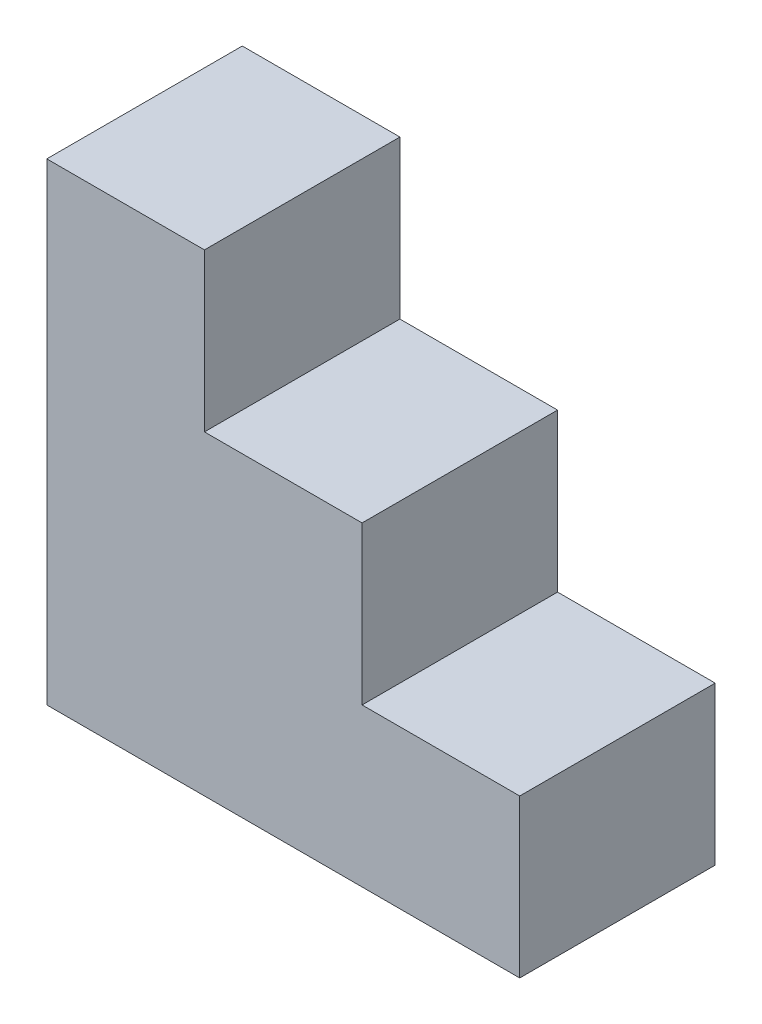
ISO-10303-21;
HEADER;
FILE_DESCRIPTION(('STEP AP214'),'2;1');
FILE_NAME('part.step','',(''),(''),'','','');
FILE_SCHEMA(('AUTOMOTIVE_DESIGN { 1 0 10303 214 1 1 1 1 }'));
ENDSEC;
DATA;
#1=APPLICATION_CONTEXT('core data for automotive mechanical design processes');
#2=APPLICATION_PROTOCOL_DEFINITION('international standard','automotive_design',2000,#1);
#3=PRODUCT_CONTEXT('',#1,'mechanical');
#4=PRODUCT('Part','Part','',(#3));
#5=PRODUCT_RELATED_PRODUCT_CATEGORY('part','',(#4));
#6=PRODUCT_DEFINITION_FORMATION('','',#4);
#7=PRODUCT_DEFINITION_CONTEXT('part definition',#1,'design');
#8=PRODUCT_DEFINITION('design','',#6,#7);
#9=PRODUCT_DEFINITION_SHAPE('','',#8);
#10=(LENGTH_UNIT() NAMED_UNIT(*) SI_UNIT(.MILLI.,.METRE.));
#11=(NAMED_UNIT(*) PLANE_ANGLE_UNIT() SI_UNIT($,.RADIAN.));
#12=(NAMED_UNIT(*) SI_UNIT($,.STERADIAN.) SOLID_ANGLE_UNIT());
#13=UNCERTAINTY_MEASURE_WITH_UNIT(LENGTH_MEASURE(1.E-05),#10,'distance_accuracy_value','');
#14=(GEOMETRIC_REPRESENTATION_CONTEXT(3) GLOBAL_UNCERTAINTY_ASSIGNED_CONTEXT((#13)) GLOBAL_UNIT_ASSIGNED_CONTEXT((#10,
#11,#12)) REPRESENTATION_CONTEXT('',''));
#15=CARTESIAN_POINT('',(0.,0.,0.));
#16=DIRECTION('',(0.,0.,1.));
#17=DIRECTION('',(1.,0.,0.));
#18=AXIS2_PLACEMENT_3D('',#15,#16,#17);
#19=CARTESIAN_POINT('',(0.,0.,12.4));
#20=DIRECTION('',(1.,0.,0.));
#21=DIRECTION('',(0.,0.,-1.));
#22=AXIS2_PLACEMENT_3D('',#19,#20,#21);
#23=PLANE('',#22);
#24=DIRECTION('',(0.,-1.,0.));
#25=VECTOR('',#24,1.);
#26=CARTESIAN_POINT('',(0.,0.,0.));
#27=LINE('',#26,#25);
#28=CARTESIAN_POINT('',(0.,30.,0.));
#29=VERTEX_POINT('',#28);
#30=CARTESIAN_POINT('',(0.,0.,0.));
#31=VERTEX_POINT('',#30);
#32=EDGE_CURVE('E129',#29,#31,#27,.T.);
#33=ORIENTED_EDGE('',*,*,#32,.T.);
#34=DIRECTION('',(0.,0.,-1.));
#35=VECTOR('',#34,1.);
#36=CARTESIAN_POINT('',(0.,0.,12.4));
#37=LINE('',#36,#35);
#38=CARTESIAN_POINT('',(0.,0.,12.4));
#39=VERTEX_POINT('',#38);
#40=EDGE_CURVE('E11',#39,#31,#37,.T.);
#41=ORIENTED_EDGE('',*,*,#40,.F.);
#42=DIRECTION('',(0.,-1.,0.));
#43=VECTOR('',#42,1.);
#44=CARTESIAN_POINT('',(0.,0.,12.4));
#45=LINE('',#44,#43);
#46=CARTESIAN_POINT('',(0.,30.,12.4));
#47=VERTEX_POINT('',#46);
#48=EDGE_CURVE('E143',#47,#39,#45,.T.);
#49=ORIENTED_EDGE('',*,*,#48,.F.);
#50=DIRECTION('',(0.,0.,-1.));
#51=VECTOR('',#50,1.);
#52=CARTESIAN_POINT('',(0.,30.,12.4));
#53=LINE('',#52,#51);
#54=EDGE_CURVE('E125',#47,#29,#53,.T.);
#55=ORIENTED_EDGE('',*,*,#54,.T.);
#56=EDGE_LOOP('',(#33,#41,#49,#55));
#57=FACE_BOUND('',#56,.T.);
#58=ADVANCED_FACE('F33',(#57),#23,.F.);
#59=CARTESIAN_POINT('',(0.,0.,12.4));
#60=DIRECTION('',(0.,1.,0.));
#61=DIRECTION('',(0.,0.,1.));
#62=AXIS2_PLACEMENT_3D('',#59,#60,#61);
#63=PLANE('',#62);
#64=DIRECTION('',(1.,0.,0.));
#65=VECTOR('',#64,1.);
#66=CARTESIAN_POINT('',(0.,0.,0.));
#67=LINE('',#66,#65);
#68=CARTESIAN_POINT('',(30.,0.,0.));
#69=VERTEX_POINT('',#68);
#70=EDGE_CURVE('E132',#31,#69,#67,.T.);
#71=ORIENTED_EDGE('',*,*,#70,.T.);
#72=DIRECTION('',(0.,0.,-1.));
#73=VECTOR('',#72,1.);
#74=CARTESIAN_POINT('',(30.,0.,12.4));
#75=LINE('',#74,#73);
#76=CARTESIAN_POINT('',(30.,0.,12.4));
#77=VERTEX_POINT('',#76);
#78=EDGE_CURVE('E41',#77,#69,#75,.T.);
#79=ORIENTED_EDGE('',*,*,#78,.F.);
#80=DIRECTION('',(1.,0.,0.));
#81=VECTOR('',#80,1.);
#82=CARTESIAN_POINT('',(0.,0.,12.4));
#83=LINE('',#82,#81);
#84=EDGE_CURVE('E92',#39,#77,#83,.T.);
#85=ORIENTED_EDGE('',*,*,#84,.F.);
#86=ORIENTED_EDGE('',*,*,#40,.T.);
#87=EDGE_LOOP('',(#71,#79,#85,#86));
#88=FACE_BOUND('',#87,.T.);
#89=ADVANCED_FACE('F178',(#88),#63,.F.);
#90=CARTESIAN_POINT('',(30.,0.,12.4));
#91=DIRECTION('',(-1.,0.,0.));
#92=DIRECTION('',(0.,0.,1.));
#93=AXIS2_PLACEMENT_3D('',#90,#91,#92);
#94=PLANE('',#93);
#95=DIRECTION('',(0.,1.,0.));
#96=VECTOR('',#95,1.);
#97=CARTESIAN_POINT('',(30.,0.,0.));
#98=LINE('',#97,#96);
#99=CARTESIAN_POINT('',(30.,10.,0.));
#100=VERTEX_POINT('',#99);
#101=EDGE_CURVE('E134',#69,#100,#98,.T.);
#102=ORIENTED_EDGE('',*,*,#101,.T.);
#103=DIRECTION('',(0.,0.,-1.));
#104=VECTOR('',#103,1.);
#105=CARTESIAN_POINT('',(30.,10.,12.4));
#106=LINE('',#105,#104);
#107=CARTESIAN_POINT('',(30.,10.,12.4));
#108=VERTEX_POINT('',#107);
#109=EDGE_CURVE('E150',#108,#100,#106,.T.);
#110=ORIENTED_EDGE('',*,*,#109,.F.);
#111=DIRECTION('',(0.,1.,0.));
#112=VECTOR('',#111,1.);
#113=CARTESIAN_POINT('',(30.,0.,12.4));
#114=LINE('',#113,#112);
#115=EDGE_CURVE('E158',#77,#108,#114,.T.);
#116=ORIENTED_EDGE('',*,*,#115,.F.);
#117=ORIENTED_EDGE('',*,*,#78,.T.);
#118=EDGE_LOOP('',(#102,#110,#116,#117));
#119=FACE_BOUND('',#118,.T.);
#120=ADVANCED_FACE('F156',(#119),#94,.F.);
#121=CARTESIAN_POINT('',(20.,10.,12.4));
#122=DIRECTION('',(0.,-1.,0.));
#123=DIRECTION('',(0.,0.,-1.));
#124=AXIS2_PLACEMENT_3D('',#121,#122,#123);
#125=PLANE('',#124);
#126=DIRECTION('',(-1.,0.,0.));
#127=VECTOR('',#126,1.);
#128=CARTESIAN_POINT('',(20.,10.,0.));
#129=LINE('',#128,#127);
#130=CARTESIAN_POINT('',(20.,10.,0.));
#131=VERTEX_POINT('',#130);
#132=EDGE_CURVE('E136',#100,#131,#129,.T.);
#133=ORIENTED_EDGE('',*,*,#132,.T.);
#134=DIRECTION('',(0.,0.,-1.));
#135=VECTOR('',#134,1.);
#136=CARTESIAN_POINT('',(20.,10.,12.4));
#137=LINE('',#136,#135);
#138=CARTESIAN_POINT('',(20.,10.,12.4));
#139=VERTEX_POINT('',#138);
#140=EDGE_CURVE('E147',#139,#131,#137,.T.);
#141=ORIENTED_EDGE('',*,*,#140,.F.);
#142=DIRECTION('',(-1.,0.,0.));
#143=VECTOR('',#142,1.);
#144=CARTESIAN_POINT('',(20.,10.,12.4));
#145=LINE('',#144,#143);
#146=EDGE_CURVE('E170',#108,#139,#145,.T.);
#147=ORIENTED_EDGE('',*,*,#146,.F.);
#148=ORIENTED_EDGE('',*,*,#109,.T.);
#149=EDGE_LOOP('',(#133,#141,#147,#148));
#150=FACE_BOUND('',#149,.T.);
#151=ADVANCED_FACE('F166',(#150),#125,.F.);
#152=CARTESIAN_POINT('',(20.,20.,12.4));
#153=DIRECTION('',(-1.,0.,0.));
#154=DIRECTION('',(0.,0.,1.));
#155=AXIS2_PLACEMENT_3D('',#152,#153,#154);
#156=PLANE('',#155);
#157=DIRECTION('',(0.,1.,0.));
#158=VECTOR('',#157,1.);
#159=CARTESIAN_POINT('',(20.,20.,0.));
#160=LINE('',#159,#158);
#161=CARTESIAN_POINT('',(20.,20.,0.));
#162=VERTEX_POINT('',#161);
#163=EDGE_CURVE('E138',#131,#162,#160,.T.);
#164=ORIENTED_EDGE('',*,*,#163,.T.);
#165=DIRECTION('',(0.,0.,-1.));
#166=VECTOR('',#165,1.);
#167=CARTESIAN_POINT('',(20.,20.,12.4));
#168=LINE('',#167,#166);
#169=CARTESIAN_POINT('',(20.,20.,12.4));
#170=VERTEX_POINT('',#169);
#171=EDGE_CURVE('E120',#170,#162,#168,.T.);
#172=ORIENTED_EDGE('',*,*,#171,.F.);
#173=DIRECTION('',(0.,1.,0.));
#174=VECTOR('',#173,1.);
#175=CARTESIAN_POINT('',(20.,20.,12.4));
#176=LINE('',#175,#174);
#177=EDGE_CURVE('E111',#139,#170,#176,.T.);
#178=ORIENTED_EDGE('',*,*,#177,.F.);
#179=ORIENTED_EDGE('',*,*,#140,.T.);
#180=EDGE_LOOP('',(#164,#172,#178,#179));
#181=FACE_BOUND('',#180,.T.);
#182=ADVANCED_FACE('F169',(#181),#156,.F.);
#183=CARTESIAN_POINT('',(10.,20.,12.4));
#184=DIRECTION('',(0.,-1.,0.));
#185=DIRECTION('',(0.,0.,-1.));
#186=AXIS2_PLACEMENT_3D('',#183,#184,#185);
#187=PLANE('',#186);
#188=DIRECTION('',(-1.,0.,0.));
#189=VECTOR('',#188,1.);
#190=CARTESIAN_POINT('',(10.,20.,0.));
#191=LINE('',#190,#189);
#192=CARTESIAN_POINT('',(10.,20.,0.));
#193=VERTEX_POINT('',#192);
#194=EDGE_CURVE('E119',#162,#193,#191,.T.);
#195=ORIENTED_EDGE('',*,*,#194,.T.);
#196=DIRECTION('',(0.,0.,-1.));
#197=VECTOR('',#196,1.);
#198=CARTESIAN_POINT('',(10.,20.,12.4));
#199=LINE('',#198,#197);
#200=CARTESIAN_POINT('',(10.,20.,12.4));
#201=VERTEX_POINT('',#200);
#202=EDGE_CURVE('E116',#201,#193,#199,.T.);
#203=ORIENTED_EDGE('',*,*,#202,.F.);
#204=DIRECTION('',(-1.,0.,0.));
#205=VECTOR('',#204,1.);
#206=CARTESIAN_POINT('',(10.,20.,12.4));
#207=LINE('',#206,#205);
#208=EDGE_CURVE('E105',#170,#201,#207,.T.);
#209=ORIENTED_EDGE('',*,*,#208,.F.);
#210=ORIENTED_EDGE('',*,*,#171,.T.);
#211=EDGE_LOOP('',(#195,#203,#209,#210));
#212=FACE_BOUND('',#211,.T.);
#213=ADVANCED_FACE('F117',(#212),#187,.F.);
#214=CARTESIAN_POINT('',(10.,30.,12.4));
#215=DIRECTION('',(-1.,0.,0.));
#216=DIRECTION('',(0.,0.,1.));
#217=AXIS2_PLACEMENT_3D('',#214,#215,#216);
#218=PLANE('',#217);
#219=DIRECTION('',(0.,1.,0.));
#220=VECTOR('',#219,1.);
#221=CARTESIAN_POINT('',(10.,30.,0.));
#222=LINE('',#221,#220);
#223=CARTESIAN_POINT('',(10.,30.,0.));
#224=VERTEX_POINT('',#223);
#225=EDGE_CURVE('E78',#193,#224,#222,.T.);
#226=ORIENTED_EDGE('',*,*,#225,.T.);
#227=DIRECTION('',(0.,0.,-1.));
#228=VECTOR('',#227,1.);
#229=CARTESIAN_POINT('',(10.,30.,12.4));
#230=LINE('',#229,#228);
#231=CARTESIAN_POINT('',(10.,30.,12.4));
#232=VERTEX_POINT('',#231);
#233=EDGE_CURVE('E121',#232,#224,#230,.T.);
#234=ORIENTED_EDGE('',*,*,#233,.F.);
#235=DIRECTION('',(0.,1.,0.));
#236=VECTOR('',#235,1.);
#237=CARTESIAN_POINT('',(10.,30.,12.4));
#238=LINE('',#237,#236);
#239=EDGE_CURVE('E109',#201,#232,#238,.T.);
#240=ORIENTED_EDGE('',*,*,#239,.F.);
#241=ORIENTED_EDGE('',*,*,#202,.T.);
#242=EDGE_LOOP('',(#226,#234,#240,#241));
#243=FACE_BOUND('',#242,.T.);
#244=ADVANCED_FACE('F123',(#243),#218,.F.);
#245=CARTESIAN_POINT('',(0.,30.,12.4));
#246=DIRECTION('',(0.,-1.,0.));
#247=DIRECTION('',(0.,0.,-1.));
#248=AXIS2_PLACEMENT_3D('',#245,#246,#247);
#249=PLANE('',#248);
#250=DIRECTION('',(-1.,0.,0.));
#251=VECTOR('',#250,1.);
#252=CARTESIAN_POINT('',(0.,30.,0.));
#253=LINE('',#252,#251);
#254=EDGE_CURVE('E84',#224,#29,#253,.T.);
#255=ORIENTED_EDGE('',*,*,#254,.T.);
#256=ORIENTED_EDGE('',*,*,#54,.F.);
#257=DIRECTION('',(-1.,0.,0.));
#258=VECTOR('',#257,1.);
#259=CARTESIAN_POINT('',(0.,30.,12.4));
#260=LINE('',#259,#258);
#261=EDGE_CURVE('E49',#232,#47,#260,.T.);
#262=ORIENTED_EDGE('',*,*,#261,.F.);
#263=ORIENTED_EDGE('',*,*,#233,.T.);
#264=EDGE_LOOP('',(#255,#256,#262,#263));
#265=FACE_BOUND('',#264,.T.);
#266=ADVANCED_FACE('F194',(#265),#249,.F.);
#267=CARTESIAN_POINT('',(0.,0.,12.4));
#268=DIRECTION('',(0.,0.,-1.));
#269=DIRECTION('',(-1.,0.,0.));
#270=AXIS2_PLACEMENT_3D('',#267,#268,#269);
#271=PLANE('',#270);
#272=ORIENTED_EDGE('',*,*,#48,.T.);
#273=ORIENTED_EDGE('',*,*,#84,.T.);
#274=ORIENTED_EDGE('',*,*,#115,.T.);
#275=ORIENTED_EDGE('',*,*,#146,.T.);
#276=ORIENTED_EDGE('',*,*,#177,.T.);
#277=ORIENTED_EDGE('',*,*,#208,.T.);
#278=ORIENTED_EDGE('',*,*,#239,.T.);
#279=ORIENTED_EDGE('',*,*,#261,.T.);
#280=EDGE_LOOP('',(#272,#273,#274,#275,#276,#277,#278,#279));
#281=FACE_BOUND('',#280,.T.);
#282=ADVANCED_FACE('F107',(#281),#271,.F.);
#283=CARTESIAN_POINT('',(0.,0.,0.));
#284=DIRECTION('',(0.,0.,-1.));
#285=DIRECTION('',(-1.,0.,0.));
#286=AXIS2_PLACEMENT_3D('',#283,#284,#285);
#287=PLANE('',#286);
#288=ORIENTED_EDGE('',*,*,#32,.F.);
#289=ORIENTED_EDGE('',*,*,#254,.F.);
#290=ORIENTED_EDGE('',*,*,#225,.F.);
#291=ORIENTED_EDGE('',*,*,#194,.F.);
#292=ORIENTED_EDGE('',*,*,#163,.F.);
#293=ORIENTED_EDGE('',*,*,#132,.F.);
#294=ORIENTED_EDGE('',*,*,#101,.F.);
#295=ORIENTED_EDGE('',*,*,#70,.F.);
#296=EDGE_LOOP('',(#288,#289,#290,#291,#292,#293,#294,#295));
#297=FACE_BOUND('',#296,.T.);
#298=ADVANCED_FACE('F162',(#297),#287,.T.);
#299=CLOSED_SHELL('',(#58,#89,#120,#151,#182,#213,#244,#266,#282,#298));
#300=MANIFOLD_SOLID_BREP('B2',#299);
#301=ADVANCED_BREP_SHAPE_REPRESENTATION('',(#18,#300),#14);
#302=SHAPE_DEFINITION_REPRESENTATION(#9,#301);
ENDSEC;
END-ISO-10303-21;
